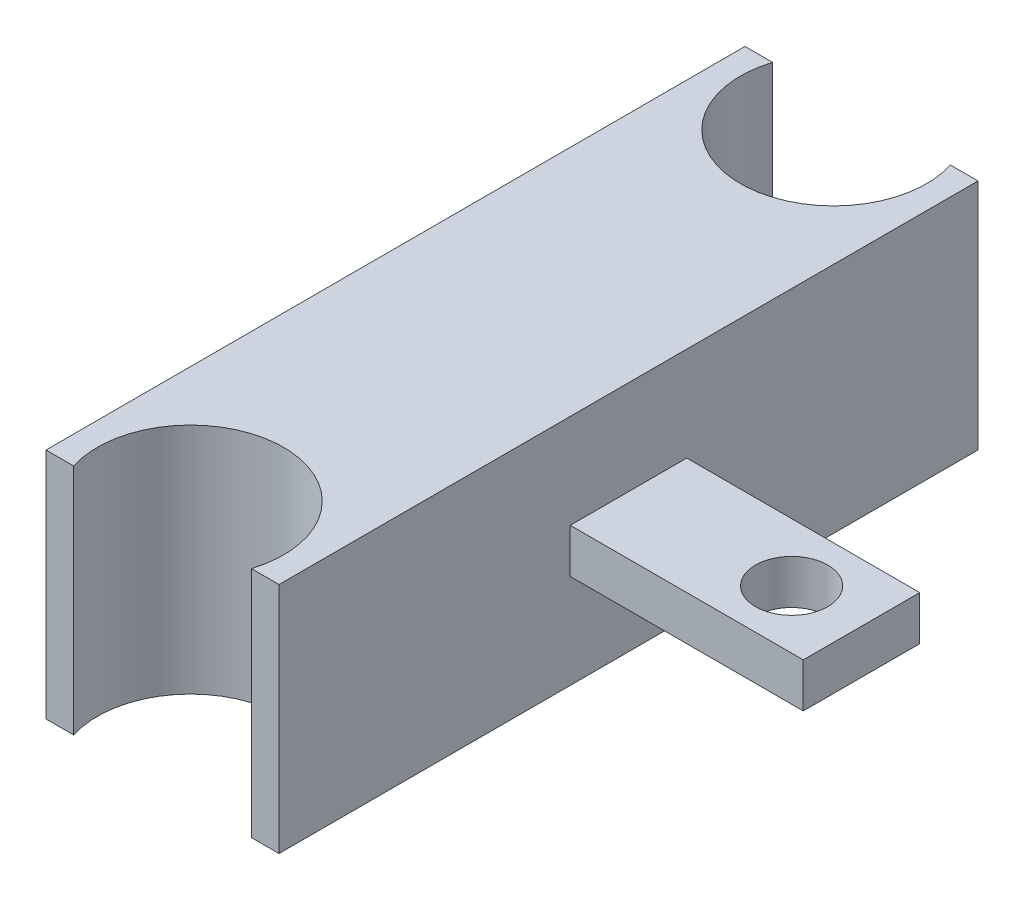
ISO-10303-21;
HEADER;
FILE_DESCRIPTION(('STEP AP214'),'2;1');
FILE_NAME('part.step','',(''),(''),'','','');
FILE_SCHEMA(('AUTOMOTIVE_DESIGN { 1 0 10303 214 1 1 1 1 }'));
ENDSEC;
DATA;
#1=APPLICATION_CONTEXT('core data for automotive mechanical design processes');
#2=APPLICATION_PROTOCOL_DEFINITION('international standard','automotive_design',2000,#1);
#3=PRODUCT_CONTEXT('',#1,'mechanical');
#4=PRODUCT('Part','Part','',(#3));
#5=PRODUCT_RELATED_PRODUCT_CATEGORY('part','',(#4));
#6=PRODUCT_DEFINITION_FORMATION('','',#4);
#7=PRODUCT_DEFINITION_CONTEXT('part definition',#1,'design');
#8=PRODUCT_DEFINITION('design','',#6,#7);
#9=PRODUCT_DEFINITION_SHAPE('','',#8);
#10=(LENGTH_UNIT() NAMED_UNIT(*) SI_UNIT(.MILLI.,.METRE.));
#11=(NAMED_UNIT(*) PLANE_ANGLE_UNIT() SI_UNIT($,.RADIAN.));
#12=(NAMED_UNIT(*) SI_UNIT($,.STERADIAN.) SOLID_ANGLE_UNIT());
#13=UNCERTAINTY_MEASURE_WITH_UNIT(LENGTH_MEASURE(1.E-05),#10,'distance_accuracy_value','');
#14=(GEOMETRIC_REPRESENTATION_CONTEXT(3) GLOBAL_UNCERTAINTY_ASSIGNED_CONTEXT((#13)) GLOBAL_UNIT_ASSIGNED_CONTEXT((#10,
#11,#12)) REPRESENTATION_CONTEXT('',''));
#15=CARTESIAN_POINT('',(0.,0.,0.));
#16=DIRECTION('',(0.,0.,1.));
#17=DIRECTION('',(1.,0.,0.));
#18=AXIS2_PLACEMENT_3D('',#15,#16,#17);
#19=CARTESIAN_POINT('',(-10.,-4.05,-17.5));
#20=DIRECTION('',(0.,0.,1.));
#21=DIRECTION('',(0.,-1.,0.));
#22=AXIS2_PLACEMENT_3D('',#19,#20,#21);
#23=PLANE('',#22);
#24=DIRECTION('',(1.,0.,0.));
#25=VECTOR('',#24,1.);
#26=CARTESIAN_POINT('',(-10.,-4.05,-17.5));
#27=LINE('',#26,#25);
#28=CARTESIAN_POINT('',(-1.18424319433222,-4.05,-17.5));
#29=VERTEX_POINT('',#28);
#30=CARTESIAN_POINT('',(0.,-4.05,-17.5));
#31=VERTEX_POINT('',#30);
#32=EDGE_CURVE('E148',#29,#31,#27,.T.);
#33=ORIENTED_EDGE('',*,*,#32,.F.);
#34=DIRECTION('',(0.,1.,0.));
#35=VECTOR('',#34,1.);
#36=CARTESIAN_POINT('',(-1.18424319433222,-4.05,-17.5));
#37=LINE('',#36,#35);
#38=CARTESIAN_POINT('',(-1.18424319433222,5.95,-17.5));
#39=VERTEX_POINT('',#38);
#40=EDGE_CURVE('E268',#29,#39,#37,.T.);
#41=ORIENTED_EDGE('',*,*,#40,.T.);
#42=DIRECTION('',(1.,0.,0.));
#43=VECTOR('',#42,1.);
#44=CARTESIAN_POINT('',(-10.,5.95,-17.5));
#45=LINE('',#44,#43);
#46=CARTESIAN_POINT('',(0.,5.95,-17.5));
#47=VERTEX_POINT('',#46);
#48=EDGE_CURVE('E256',#39,#47,#45,.T.);
#49=ORIENTED_EDGE('',*,*,#48,.T.);
#50=DIRECTION('',(0.,-1.,0.));
#51=VECTOR('',#50,1.);
#52=CARTESIAN_POINT('',(0.,-4.05,-17.5));
#53=LINE('',#52,#51);
#54=EDGE_CURVE('E265',#47,#31,#53,.T.);
#55=ORIENTED_EDGE('',*,*,#54,.T.);
#56=EDGE_LOOP('',(#33,#41,#49,#55));
#57=FACE_BOUND('',#56,.T.);
#58=ADVANCED_FACE('F35',(#57),#23,.F.);
#59=CARTESIAN_POINT('',(-10.,-4.05,12.5));
#60=DIRECTION('',(0.,0.,-1.));
#61=DIRECTION('',(-1.,0.,0.));
#62=AXIS2_PLACEMENT_3D('',#59,#60,#61);
#63=PLANE('',#62);
#64=DIRECTION('',(1.,0.,0.));
#65=VECTOR('',#64,1.);
#66=CARTESIAN_POINT('',(-10.,-4.05,12.5));
#67=LINE('',#66,#65);
#68=CARTESIAN_POINT('',(-10.,-4.05,12.5));
#69=VERTEX_POINT('',#68);
#70=CARTESIAN_POINT('',(-8.81575680566778,-4.05,12.5));
#71=VERTEX_POINT('',#70);
#72=EDGE_CURVE('E145',#69,#71,#67,.T.);
#73=ORIENTED_EDGE('',*,*,#72,.T.);
#74=DIRECTION('',(0.,1.,0.));
#75=VECTOR('',#74,1.);
#76=CARTESIAN_POINT('',(-8.81575680566778,-4.05,12.5));
#77=LINE('',#76,#75);
#78=CARTESIAN_POINT('',(-8.81575680566778,5.95,12.5));
#79=VERTEX_POINT('',#78);
#80=EDGE_CURVE('E124',#71,#79,#77,.T.);
#81=ORIENTED_EDGE('',*,*,#80,.T.);
#82=DIRECTION('',(1.,0.,0.));
#83=VECTOR('',#82,1.);
#84=CARTESIAN_POINT('',(-10.,5.95,12.5));
#85=LINE('',#84,#83);
#86=CARTESIAN_POINT('',(-10.,5.95,12.5));
#87=VERTEX_POINT('',#86);
#88=EDGE_CURVE('E146',#87,#79,#85,.T.);
#89=ORIENTED_EDGE('',*,*,#88,.F.);
#90=DIRECTION('',(0.,1.,0.));
#91=VECTOR('',#90,1.);
#92=CARTESIAN_POINT('',(-10.,-4.05,12.5));
#93=LINE('',#92,#91);
#94=EDGE_CURVE('E270',#69,#87,#93,.T.);
#95=ORIENTED_EDGE('',*,*,#94,.F.);
#96=EDGE_LOOP('',(#73,#81,#89,#95));
#97=FACE_BOUND('',#96,.T.);
#98=ADVANCED_FACE('F212',(#97),#63,.F.);
#99=CARTESIAN_POINT('',(0.,1.9,0.));
#100=DIRECTION('',(0.,-1.,0.));
#101=DIRECTION('',(0.,0.,-1.));
#102=AXIS2_PLACEMENT_3D('',#99,#100,#101);
#103=PLANE('',#102);
#104=DIRECTION('',(0.,0.,1.));
#105=VECTOR('',#104,1.);
#106=CARTESIAN_POINT('',(0.,1.9,0.));
#107=LINE('',#106,#105);
#108=CARTESIAN_POINT('',(0.,1.9,-5.));
#109=VERTEX_POINT('',#108);
#110=CARTESIAN_POINT('',(0.,1.9,0.));
#111=VERTEX_POINT('',#110);
#112=EDGE_CURVE('E162',#109,#111,#107,.T.);
#113=ORIENTED_EDGE('',*,*,#112,.T.);
#114=DIRECTION('',(1.,0.,0.));
#115=VECTOR('',#114,1.);
#116=CARTESIAN_POINT('',(0.,1.9,0.));
#117=LINE('',#116,#115);
#118=CARTESIAN_POINT('',(10.,1.9,0.));
#119=VERTEX_POINT('',#118);
#120=EDGE_CURVE('E165',#111,#119,#117,.T.);
#121=ORIENTED_EDGE('',*,*,#120,.T.);
#122=DIRECTION('',(0.,0.,-1.));
#123=VECTOR('',#122,1.);
#124=CARTESIAN_POINT('',(10.,1.9,0.));
#125=LINE('',#124,#123);
#126=CARTESIAN_POINT('',(10.,1.9,-5.));
#127=VERTEX_POINT('',#126);
#128=EDGE_CURVE('E168',#119,#127,#125,.T.);
#129=ORIENTED_EDGE('',*,*,#128,.T.);
#130=DIRECTION('',(-1.,0.,0.));
#131=VECTOR('',#130,1.);
#132=CARTESIAN_POINT('',(0.,1.9,-5.));
#133=LINE('',#132,#131);
#134=EDGE_CURVE('E170',#127,#109,#133,.T.);
#135=ORIENTED_EDGE('',*,*,#134,.T.);
#136=EDGE_LOOP('',(#113,#121,#129,#135));
#137=FACE_BOUND('',#136,.T.);
#138=CARTESIAN_POINT('',(7.,1.9,-2.5));
#139=DIRECTION('',(0.,1.,0.));
#140=DIRECTION('',(0.,0.,1.));
#141=AXIS2_PLACEMENT_3D('',#138,#139,#140);
#142=CIRCLE('',#141,1.55);
#143=CARTESIAN_POINT('',(7.,1.9,-4.05));
#144=VERTEX_POINT('',#143);
#145=EDGE_CURVE('E156',#144,#144,#142,.T.);
#146=ORIENTED_EDGE('',*,*,#145,.F.);
#147=EDGE_LOOP('',(#146));
#148=FACE_BOUND('',#147,.T.);
#149=ADVANCED_FACE('F209',(#137,#148),#103,.F.);
#150=CARTESIAN_POINT('',(0.,0.,0.));
#151=DIRECTION('',(0.,-1.,0.));
#152=DIRECTION('',(0.,0.,-1.));
#153=AXIS2_PLACEMENT_3D('',#150,#151,#152);
#154=PLANE('',#153);
#155=DIRECTION('',(0.,0.,1.));
#156=VECTOR('',#155,1.);
#157=CARTESIAN_POINT('',(0.,0.,0.));
#158=LINE('',#157,#156);
#159=CARTESIAN_POINT('',(0.,0.,-5.));
#160=VERTEX_POINT('',#159);
#161=CARTESIAN_POINT('',(0.,0.,0.));
#162=VERTEX_POINT('',#161);
#163=EDGE_CURVE('E159',#160,#162,#158,.T.);
#164=ORIENTED_EDGE('',*,*,#163,.F.);
#165=DIRECTION('',(-1.,0.,0.));
#166=VECTOR('',#165,1.);
#167=CARTESIAN_POINT('',(0.,0.,-5.));
#168=LINE('',#167,#166);
#169=CARTESIAN_POINT('',(10.,0.,-5.));
#170=VERTEX_POINT('',#169);
#171=EDGE_CURVE('E166',#170,#160,#168,.T.);
#172=ORIENTED_EDGE('',*,*,#171,.F.);
#173=DIRECTION('',(0.,0.,-1.));
#174=VECTOR('',#173,1.);
#175=CARTESIAN_POINT('',(10.,0.,0.));
#176=LINE('',#175,#174);
#177=CARTESIAN_POINT('',(10.,0.,0.));
#178=VERTEX_POINT('',#177);
#179=EDGE_CURVE('E177',#178,#170,#176,.T.);
#180=ORIENTED_EDGE('',*,*,#179,.F.);
#181=DIRECTION('',(1.,0.,0.));
#182=VECTOR('',#181,1.);
#183=CARTESIAN_POINT('',(0.,0.,0.));
#184=LINE('',#183,#182);
#185=EDGE_CURVE('E175',#162,#178,#184,.T.);
#186=ORIENTED_EDGE('',*,*,#185,.F.);
#187=EDGE_LOOP('',(#164,#172,#180,#186));
#188=FACE_BOUND('',#187,.T.);
#189=CARTESIAN_POINT('',(7.,0.,-2.5));
#190=DIRECTION('',(0.,1.,0.));
#191=DIRECTION('',(0.,0.,1.));
#192=AXIS2_PLACEMENT_3D('',#189,#190,#191);
#193=CIRCLE('',#192,1.55);
#194=CARTESIAN_POINT('',(7.,0.,-4.05));
#195=VERTEX_POINT('',#194);
#196=EDGE_CURVE('E155',#195,#195,#193,.T.);
#197=ORIENTED_EDGE('',*,*,#196,.T.);
#198=EDGE_LOOP('',(#197));
#199=FACE_BOUND('',#198,.T.);
#200=ADVANCED_FACE('F198',(#188,#199),#154,.T.);
#201=CARTESIAN_POINT('',(0.,1.9,0.));
#202=DIRECTION('',(0.,0.,-1.));
#203=DIRECTION('',(-1.,0.,0.));
#204=AXIS2_PLACEMENT_3D('',#201,#202,#203);
#205=PLANE('',#204);
#206=ORIENTED_EDGE('',*,*,#185,.T.);
#207=DIRECTION('',(0.,-1.,0.));
#208=VECTOR('',#207,1.);
#209=CARTESIAN_POINT('',(10.,1.9,0.));
#210=LINE('',#209,#208);
#211=EDGE_CURVE('E186',#119,#178,#210,.T.);
#212=ORIENTED_EDGE('',*,*,#211,.F.);
#213=ORIENTED_EDGE('',*,*,#120,.F.);
#214=DIRECTION('',(0.,-1.,0.));
#215=VECTOR('',#214,1.);
#216=CARTESIAN_POINT('',(0.,1.9,0.));
#217=LINE('',#216,#215);
#218=EDGE_CURVE('E43',#111,#162,#217,.T.);
#219=ORIENTED_EDGE('',*,*,#218,.T.);
#220=EDGE_LOOP('',(#206,#212,#213,#219));
#221=FACE_BOUND('',#220,.T.);
#222=ADVANCED_FACE('F37',(#221),#205,.F.);
#223=CARTESIAN_POINT('',(10.,1.9,0.));
#224=DIRECTION('',(-1.,0.,0.));
#225=DIRECTION('',(0.,0.,1.));
#226=AXIS2_PLACEMENT_3D('',#223,#224,#225);
#227=PLANE('',#226);
#228=ORIENTED_EDGE('',*,*,#179,.T.);
#229=DIRECTION('',(0.,-1.,0.));
#230=VECTOR('',#229,1.);
#231=CARTESIAN_POINT('',(10.,1.9,-5.));
#232=LINE('',#231,#230);
#233=EDGE_CURVE('E183',#127,#170,#232,.T.);
#234=ORIENTED_EDGE('',*,*,#233,.F.);
#235=ORIENTED_EDGE('',*,*,#128,.F.);
#236=ORIENTED_EDGE('',*,*,#211,.T.);
#237=EDGE_LOOP('',(#228,#234,#235,#236));
#238=FACE_BOUND('',#237,.T.);
#239=ADVANCED_FACE('F207',(#238),#227,.F.);
#240=CARTESIAN_POINT('',(0.,1.9,-5.));
#241=DIRECTION('',(0.,0.,1.));
#242=DIRECTION('',(1.,0.,0.));
#243=AXIS2_PLACEMENT_3D('',#240,#241,#242);
#244=PLANE('',#243);
#245=ORIENTED_EDGE('',*,*,#171,.T.);
#246=DIRECTION('',(0.,-1.,0.));
#247=VECTOR('',#246,1.);
#248=CARTESIAN_POINT('',(0.,1.9,-5.));
#249=LINE('',#248,#247);
#250=EDGE_CURVE('E172',#109,#160,#249,.T.);
#251=ORIENTED_EDGE('',*,*,#250,.F.);
#252=ORIENTED_EDGE('',*,*,#134,.F.);
#253=ORIENTED_EDGE('',*,*,#233,.T.);
#254=EDGE_LOOP('',(#245,#251,#252,#253));
#255=FACE_BOUND('',#254,.T.);
#256=ADVANCED_FACE('F202',(#255),#244,.F.);
#257=CARTESIAN_POINT('',(7.,1.9,-2.5));
#258=DIRECTION('',(0.,-1.,0.));
#259=DIRECTION('',(0.,0.,-1.));
#260=AXIS2_PLACEMENT_3D('',#257,#258,#259);
#261=CYLINDRICAL_SURFACE('',#260,1.55);
#262=CARTESIAN_POINT('',(7.,1.9,-4.05));
#263=CARTESIAN_POINT('',(7.,1.88020833333333,-4.05));
#264=CARTESIAN_POINT('',(7.,1.86041666666667,-4.05));
#265=CARTESIAN_POINT('',(7.,1.82083333333333,-4.05));
#266=CARTESIAN_POINT('',(7.,1.80104166666667,-4.05));
#267=CARTESIAN_POINT('',(7.,1.76145833333333,-4.05));
#268=CARTESIAN_POINT('',(7.,1.74166666666667,-4.05));
#269=CARTESIAN_POINT('',(7.,1.70208333333333,-4.05));
#270=CARTESIAN_POINT('',(7.,1.68229166666667,-4.05));
#271=CARTESIAN_POINT('',(7.,1.64270833333333,-4.05));
#272=CARTESIAN_POINT('',(7.,1.62291666666667,-4.05));
#273=CARTESIAN_POINT('',(7.,1.58333333333333,-4.05));
#274=CARTESIAN_POINT('',(7.,1.56354166666667,-4.05));
#275=CARTESIAN_POINT('',(7.,1.52395833333333,-4.05));
#276=CARTESIAN_POINT('',(7.,1.50416666666667,-4.05));
#277=CARTESIAN_POINT('',(7.,1.46458333333333,-4.05));
#278=CARTESIAN_POINT('',(7.,1.44479166666667,-4.05));
#279=CARTESIAN_POINT('',(7.,1.40520833333333,-4.05));
#280=CARTESIAN_POINT('',(7.,1.38541666666667,-4.05));
#281=CARTESIAN_POINT('',(7.,1.34583333333333,-4.05));
#282=CARTESIAN_POINT('',(7.,1.32604166666667,-4.05));
#283=CARTESIAN_POINT('',(7.,1.28645833333333,-4.05));
#284=CARTESIAN_POINT('',(7.,1.26666666666667,-4.05));
#285=CARTESIAN_POINT('',(7.,1.22708333333333,-4.05));
#286=CARTESIAN_POINT('',(7.,1.20729166666667,-4.05));
#287=CARTESIAN_POINT('',(7.,1.16770833333333,-4.05));
#288=CARTESIAN_POINT('',(7.,1.14791666666667,-4.05));
#289=CARTESIAN_POINT('',(7.,1.10833333333333,-4.05));
#290=CARTESIAN_POINT('',(7.,1.08854166666667,-4.05));
#291=CARTESIAN_POINT('',(7.,1.04895833333333,-4.05));
#292=CARTESIAN_POINT('',(7.,1.02916666666667,-4.05));
#293=CARTESIAN_POINT('',(7.,0.989583333333333,-4.05));
#294=CARTESIAN_POINT('',(7.,0.969791666666667,-4.05));
#295=CARTESIAN_POINT('',(7.,0.930208333333333,-4.05));
#296=CARTESIAN_POINT('',(7.,0.910416666666667,-4.05));
#297=CARTESIAN_POINT('',(7.,0.870833333333333,-4.05));
#298=CARTESIAN_POINT('',(7.,0.851041666666667,-4.05));
#299=CARTESIAN_POINT('',(7.,0.811458333333333,-4.05));
#300=CARTESIAN_POINT('',(7.,0.791666666666667,-4.05));
#301=CARTESIAN_POINT('',(7.,0.752083333333333,-4.05));
#302=CARTESIAN_POINT('',(7.,0.732291666666667,-4.05));
#303=CARTESIAN_POINT('',(7.,0.692708333333333,-4.05));
#304=CARTESIAN_POINT('',(7.,0.672916666666667,-4.05));
#305=CARTESIAN_POINT('',(7.,0.633333333333333,-4.05));
#306=CARTESIAN_POINT('',(7.,0.613541666666667,-4.05));
#307=CARTESIAN_POINT('',(7.,0.573958333333333,-4.05));
#308=CARTESIAN_POINT('',(7.,0.554166666666667,-4.05));
#309=CARTESIAN_POINT('',(7.,0.514583333333333,-4.05));
#310=CARTESIAN_POINT('',(7.,0.494791666666667,-4.05));
#311=CARTESIAN_POINT('',(7.,0.455208333333333,-4.05));
#312=CARTESIAN_POINT('',(7.,0.435416666666667,-4.05));
#313=CARTESIAN_POINT('',(7.,0.395833333333333,-4.05));
#314=CARTESIAN_POINT('',(7.,0.376041666666667,-4.05));
#315=CARTESIAN_POINT('',(7.,0.336458333333333,-4.05));
#316=CARTESIAN_POINT('',(7.,0.316666666666667,-4.05));
#317=CARTESIAN_POINT('',(7.,0.277083333333333,-4.05));
#318=CARTESIAN_POINT('',(7.,0.257291666666667,-4.05));
#319=CARTESIAN_POINT('',(7.,0.217708333333333,-4.05));
#320=CARTESIAN_POINT('',(7.,0.197916666666667,-4.05));
#321=CARTESIAN_POINT('',(7.,0.158333333333333,-4.05));
#322=CARTESIAN_POINT('',(7.,0.138541666666667,-4.05));
#323=CARTESIAN_POINT('',(7.,0.0989583333333333,-4.05));
#324=CARTESIAN_POINT('',(7.,0.0791666666666666,-4.05));
#325=CARTESIAN_POINT('',(7.,0.0395833333333333,-4.05));
#326=CARTESIAN_POINT('',(7.,0.0197916666666666,-4.05));
#327=CARTESIAN_POINT('',(7.,0.,-4.05));
#328=B_SPLINE_CURVE_WITH_KNOTS('',3,(#262,#263,#264,#265,#266,#267,#268,#269,#270,#271,#272,
#273,#274,#275,#276,#277,#278,#279,#280,#281,#282,#283,#284,#285,#286,#287,#288,#289,#290,#291,
#292,#293,#294,#295,#296,#297,#298,#299,#300,#301,#302,#303,#304,#305,#306,#307,#308,#309,#310,
#311,#312,#313,#314,#315,#316,#317,#318,#319,#320,#321,#322,#323,#324,#325,#326,#327),
.UNSPECIFIED.,.F.,.F.,(4,2,2,2,2,2,2,2,2,2,2,2,2,2,2,2,2,2,2,2,2,2,2,2,2,2,2,2,2,2,2,2,4),(0.,
0.059375,0.11875,0.178125,0.2375,0.296875,0.35625,0.415625,0.475,0.534375,0.59375,0.653125,
0.7125,0.771875,0.83125,0.890625,0.95,1.009375,1.06875,1.128125,1.1875,1.246875,1.30625,
1.365625,1.425,1.484375,1.54375,1.603125,1.6625,1.721875,1.78125,1.840625,1.9),.UNSPECIFIED.);
#329=EDGE_CURVE('BSEAM216',#144,#195,#328,.T.);
#330=ORIENTED_EDGE('',*,*,#145,.T.);
#331=ORIENTED_EDGE('',*,*,#196,.F.);
#332=ORIENTED_EDGE('',*,*,#329,.T.);
#333=ORIENTED_EDGE('',*,*,#329,.F.);
#334=EDGE_LOOP('',(#330,#332,#331,#333));
#335=FACE_BOUND('',#334,.T.);
#336=ADVANCED_FACE('F216',(#335),#261,.F.);
#337=CARTESIAN_POINT('',(0.,0.,0.));
#338=DIRECTION('',(-1.,0.,0.));
#339=DIRECTION('',(0.,0.,1.));
#340=AXIS2_PLACEMENT_3D('',#337,#338,#339);
#341=PLANE('',#340);
#342=ORIENTED_EDGE('',*,*,#54,.F.);
#343=DIRECTION('',(0.,0.,-1.));
#344=VECTOR('',#343,1.);
#345=CARTESIAN_POINT('',(0.,5.95,12.5));
#346=LINE('',#345,#344);
#347=CARTESIAN_POINT('',(0.,5.95,12.5));
#348=VERTEX_POINT('',#347);
#349=EDGE_CURVE('E259',#348,#47,#346,.T.);
#350=ORIENTED_EDGE('',*,*,#349,.F.);
#351=DIRECTION('',(0.,1.,0.));
#352=VECTOR('',#351,1.);
#353=CARTESIAN_POINT('',(0.,-4.05,12.5));
#354=LINE('',#353,#352);
#355=CARTESIAN_POINT('',(0.,-4.05,12.5));
#356=VERTEX_POINT('',#355);
#357=EDGE_CURVE('E262',#356,#348,#354,.T.);
#358=ORIENTED_EDGE('',*,*,#357,.F.);
#359=DIRECTION('',(0.,0.,1.));
#360=VECTOR('',#359,1.);
#361=CARTESIAN_POINT('',(0.,-4.05,12.5));
#362=LINE('',#361,#360);
#363=EDGE_CURVE('E143',#31,#356,#362,.T.);
#364=ORIENTED_EDGE('',*,*,#363,.F.);
#365=EDGE_LOOP('',(#342,#350,#358,#364));
#366=FACE_BOUND('',#365,.T.);
#367=ORIENTED_EDGE('',*,*,#250,.T.);
#368=ORIENTED_EDGE('',*,*,#163,.T.);
#369=ORIENTED_EDGE('',*,*,#218,.F.);
#370=ORIENTED_EDGE('',*,*,#112,.F.);
#371=EDGE_LOOP('',(#367,#368,#369,#370));
#372=FACE_BOUND('',#371,.T.);
#373=ADVANCED_FACE('F194',(#366,#372),#341,.F.);
#374=CARTESIAN_POINT('',(-10.,5.95,-17.5));
#375=VERTEX_POINT('',#374);
#376=CARTESIAN_POINT('',(-8.81575680566778,5.95,-17.5));
#377=VERTEX_POINT('',#376);
#378=EDGE_CURVE('E250',#375,#377,#45,.T.);
#379=ORIENTED_EDGE('',*,*,#378,.T.);
#380=DIRECTION('',(0.,1.,0.));
#381=VECTOR('',#380,1.);
#382=CARTESIAN_POINT('',(-8.81575680566778,-4.05,-17.5));
#383=LINE('',#382,#381);
#384=CARTESIAN_POINT('',(-8.81575680566778,-4.05,-17.5));
#385=VERTEX_POINT('',#384);
#386=EDGE_CURVE('E58',#377,#385,#383,.F.);
#387=ORIENTED_EDGE('',*,*,#386,.T.);
#388=CARTESIAN_POINT('',(-10.,-4.05,-17.5));
#389=VERTEX_POINT('',#388);
#390=EDGE_CURVE('E153',#389,#385,#27,.T.);
#391=ORIENTED_EDGE('',*,*,#390,.F.);
#392=DIRECTION('',(0.,-1.,0.));
#393=VECTOR('',#392,1.);
#394=CARTESIAN_POINT('',(-10.,-4.05,-17.5));
#395=LINE('',#394,#393);
#396=EDGE_CURVE('E253',#375,#389,#395,.T.);
#397=ORIENTED_EDGE('',*,*,#396,.F.);
#398=EDGE_LOOP('',(#379,#387,#391,#397));
#399=FACE_BOUND('',#398,.T.);
#400=ADVANCED_FACE('F230',(#399),#23,.F.);
#401=CARTESIAN_POINT('',(-10.,-4.05,12.5));
#402=DIRECTION('',(0.,1.,0.));
#403=DIRECTION('',(0.,0.,1.));
#404=AXIS2_PLACEMENT_3D('',#401,#402,#403);
#405=PLANE('',#404);
#406=ORIENTED_EDGE('',*,*,#390,.T.);
#407=CARTESIAN_POINT('',(-5.,-4.05,-16.3));
#408=DIRECTION('',(0.,1.,0.));
#409=DIRECTION('',(0.,0.,1.));
#410=AXIS2_PLACEMENT_3D('',#407,#408,#409);
#411=CIRCLE('',#410,4.);
#412=EDGE_CURVE('E138',#385,#29,#411,.T.);
#413=ORIENTED_EDGE('',*,*,#412,.T.);
#414=ORIENTED_EDGE('',*,*,#32,.T.);
#415=ORIENTED_EDGE('',*,*,#363,.T.);
#416=CARTESIAN_POINT('',(-1.18424319433221,-4.05,12.5));
#417=VERTEX_POINT('',#416);
#418=EDGE_CURVE('E135',#417,#356,#67,.T.);
#419=ORIENTED_EDGE('',*,*,#418,.F.);
#420=CARTESIAN_POINT('',(-5.,-4.05,11.3));
#421=DIRECTION('',(0.,1.,0.));
#422=DIRECTION('',(0.,0.,1.));
#423=AXIS2_PLACEMENT_3D('',#420,#421,#422);
#424=CIRCLE('',#423,4.);
#425=EDGE_CURVE('E121',#417,#71,#424,.T.);
#426=ORIENTED_EDGE('',*,*,#425,.T.);
#427=ORIENTED_EDGE('',*,*,#72,.F.);
#428=DIRECTION('',(0.,0.,1.));
#429=VECTOR('',#428,1.);
#430=CARTESIAN_POINT('',(-10.,-4.05,12.5));
#431=LINE('',#430,#429);
#432=EDGE_CURVE('E272',#389,#69,#431,.T.);
#433=ORIENTED_EDGE('',*,*,#432,.F.);
#434=EDGE_LOOP('',(#406,#413,#414,#415,#419,#426,#427,#433));
#435=FACE_BOUND('',#434,.T.);
#436=ADVANCED_FACE('F141',(#435),#405,.F.);
#437=CARTESIAN_POINT('',(-1.18424319433221,5.95,12.5));
#438=VERTEX_POINT('',#437);
#439=EDGE_CURVE('E137',#438,#348,#85,.T.);
#440=ORIENTED_EDGE('',*,*,#439,.F.);
#441=DIRECTION('',(0.,1.,0.));
#442=VECTOR('',#441,1.);
#443=CARTESIAN_POINT('',(-1.18424319433221,-4.05,12.5));
#444=LINE('',#443,#442);
#445=EDGE_CURVE('E50',#438,#417,#444,.F.);
#446=ORIENTED_EDGE('',*,*,#445,.T.);
#447=ORIENTED_EDGE('',*,*,#418,.T.);
#448=ORIENTED_EDGE('',*,*,#357,.T.);
#449=EDGE_LOOP('',(#440,#446,#447,#448));
#450=FACE_BOUND('',#449,.T.);
#451=ADVANCED_FACE('F133',(#450),#63,.F.);
#452=CARTESIAN_POINT('',(-10.,5.95,12.5));
#453=DIRECTION('',(0.,-1.,0.));
#454=DIRECTION('',(0.,0.,-1.));
#455=AXIS2_PLACEMENT_3D('',#452,#453,#454);
#456=PLANE('',#455);
#457=ORIENTED_EDGE('',*,*,#48,.F.);
#458=CARTESIAN_POINT('',(-5.,5.95,-16.3));
#459=DIRECTION('',(0.,-1.,0.));
#460=DIRECTION('',(0.,0.,-1.));
#461=AXIS2_PLACEMENT_3D('',#458,#459,#460);
#462=CIRCLE('',#461,4.);
#463=EDGE_CURVE('E11',#39,#377,#462,.T.);
#464=ORIENTED_EDGE('',*,*,#463,.T.);
#465=ORIENTED_EDGE('',*,*,#378,.F.);
#466=DIRECTION('',(0.,0.,-1.));
#467=VECTOR('',#466,1.);
#468=CARTESIAN_POINT('',(-10.,5.95,12.5));
#469=LINE('',#468,#467);
#470=EDGE_CURVE('E257',#87,#375,#469,.T.);
#471=ORIENTED_EDGE('',*,*,#470,.F.);
#472=ORIENTED_EDGE('',*,*,#88,.T.);
#473=CARTESIAN_POINT('',(-5.,5.95,11.3));
#474=DIRECTION('',(0.,1.,0.));
#475=DIRECTION('',(0.,0.,1.));
#476=AXIS2_PLACEMENT_3D('',#473,#474,#475);
#477=CIRCLE('',#476,4.);
#478=EDGE_CURVE('E129',#438,#79,#477,.T.);
#479=ORIENTED_EDGE('',*,*,#478,.F.);
#480=ORIENTED_EDGE('',*,*,#439,.T.);
#481=ORIENTED_EDGE('',*,*,#349,.T.);
#482=EDGE_LOOP('',(#457,#464,#465,#471,#472,#479,#480,#481));
#483=FACE_BOUND('',#482,.T.);
#484=ADVANCED_FACE('F284',(#483),#456,.F.);
#485=CARTESIAN_POINT('',(-10.,0.,0.));
#486=DIRECTION('',(-1.,0.,0.));
#487=DIRECTION('',(0.,0.,1.));
#488=AXIS2_PLACEMENT_3D('',#485,#486,#487);
#489=PLANE('',#488);
#490=ORIENTED_EDGE('',*,*,#396,.T.);
#491=ORIENTED_EDGE('',*,*,#432,.T.);
#492=ORIENTED_EDGE('',*,*,#94,.T.);
#493=ORIENTED_EDGE('',*,*,#470,.T.);
#494=EDGE_LOOP('',(#490,#491,#492,#493));
#495=FACE_BOUND('',#494,.T.);
#496=ADVANCED_FACE('F288',(#495),#489,.T.);
#497=CARTESIAN_POINT('',(-5.,-4.05,11.3));
#498=DIRECTION('',(0.,1.,0.));
#499=DIRECTION('',(0.,0.,1.));
#500=AXIS2_PLACEMENT_3D('',#497,#498,#499);
#501=CYLINDRICAL_SURFACE('',#500,4.);
#502=ORIENTED_EDGE('',*,*,#425,.F.);
#503=ORIENTED_EDGE('',*,*,#445,.F.);
#504=ORIENTED_EDGE('',*,*,#478,.T.);
#505=ORIENTED_EDGE('',*,*,#80,.F.);
#506=EDGE_LOOP('',(#502,#503,#504,#505));
#507=FACE_BOUND('',#506,.T.);
#508=ADVANCED_FACE('F122',(#507),#501,.F.);
#509=CARTESIAN_POINT('',(-5.,-4.05,-16.3));
#510=DIRECTION('',(0.,1.,0.));
#511=DIRECTION('',(0.,0.,1.));
#512=AXIS2_PLACEMENT_3D('',#509,#510,#511);
#513=CYLINDRICAL_SURFACE('',#512,4.);
#514=ORIENTED_EDGE('',*,*,#412,.F.);
#515=ORIENTED_EDGE('',*,*,#386,.F.);
#516=ORIENTED_EDGE('',*,*,#463,.F.);
#517=ORIENTED_EDGE('',*,*,#40,.F.);
#518=EDGE_LOOP('',(#514,#515,#516,#517));
#519=FACE_BOUND('',#518,.T.);
#520=ADVANCED_FACE('F295',(#519),#513,.F.);
#521=CLOSED_SHELL('',(#58,#98,#149,#200,#222,#239,#256,#336,#373,#400,#436,#451,#484,#496,#508,#520));
#522=MANIFOLD_SOLID_BREP('B2',#521);
#523=ADVANCED_BREP_SHAPE_REPRESENTATION('',(#18,#522),#14);
#524=SHAPE_DEFINITION_REPRESENTATION(#9,#523);
ENDSEC;
END-ISO-10303-21;
